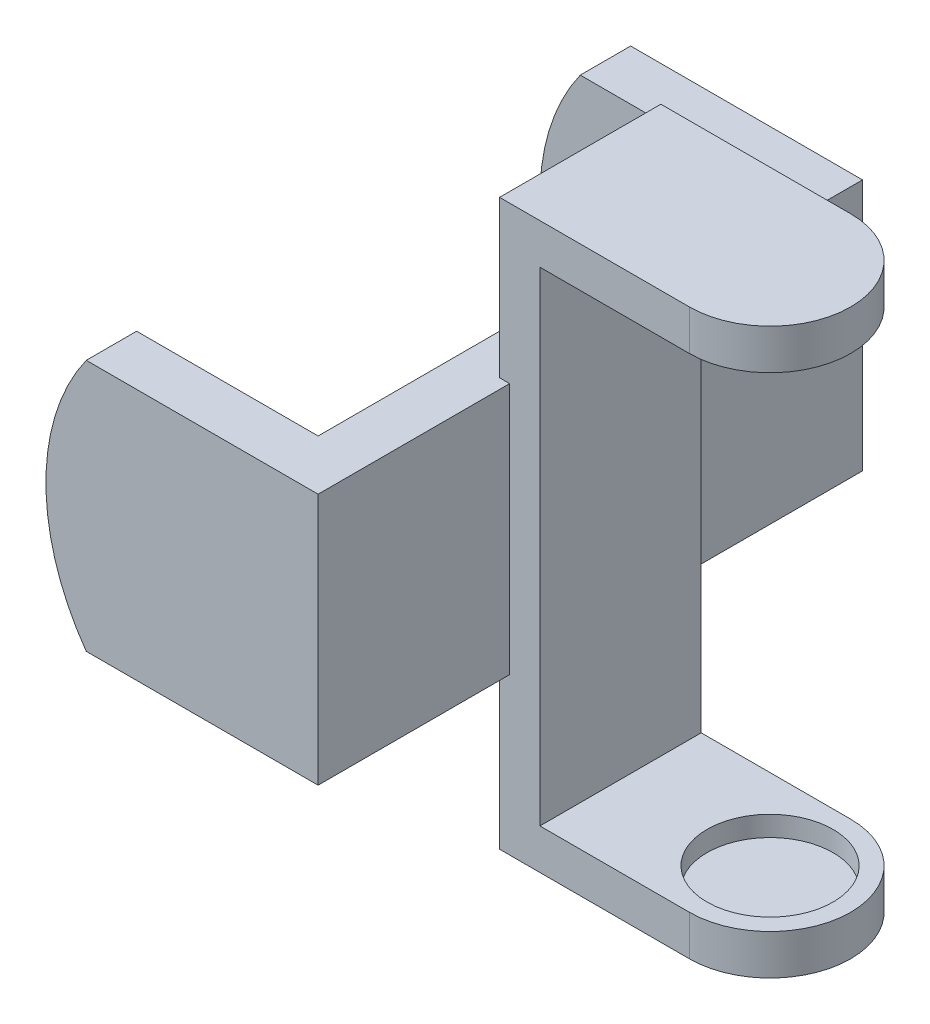
ISO-10303-21;
HEADER;
FILE_DESCRIPTION(('STEP AP214'),'2;1');
FILE_NAME('part.step','',(''),(''),'','','');
FILE_SCHEMA(('AUTOMOTIVE_DESIGN { 1 0 10303 214 1 1 1 1 }'));
ENDSEC;
DATA;
#1=APPLICATION_CONTEXT('core data for automotive mechanical design processes');
#2=APPLICATION_PROTOCOL_DEFINITION('international standard','automotive_design',2000,#1);
#3=PRODUCT_CONTEXT('',#1,'mechanical');
#4=PRODUCT('Part','Part','',(#3));
#5=PRODUCT_RELATED_PRODUCT_CATEGORY('part','',(#4));
#6=PRODUCT_DEFINITION_FORMATION('','',#4);
#7=PRODUCT_DEFINITION_CONTEXT('part definition',#1,'design');
#8=PRODUCT_DEFINITION('design','',#6,#7);
#9=PRODUCT_DEFINITION_SHAPE('','',#8);
#10=(LENGTH_UNIT() NAMED_UNIT(*) SI_UNIT(.MILLI.,.METRE.));
#11=(NAMED_UNIT(*) PLANE_ANGLE_UNIT() SI_UNIT($,.RADIAN.));
#12=(NAMED_UNIT(*) SI_UNIT($,.STERADIAN.) SOLID_ANGLE_UNIT());
#13=UNCERTAINTY_MEASURE_WITH_UNIT(LENGTH_MEASURE(1.E-05),#10,'distance_accuracy_value','');
#14=(GEOMETRIC_REPRESENTATION_CONTEXT(3) GLOBAL_UNCERTAINTY_ASSIGNED_CONTEXT((#13)) GLOBAL_UNIT_ASSIGNED_CONTEXT((#10,
#11,#12)) REPRESENTATION_CONTEXT('',''));
#15=CARTESIAN_POINT('',(0.,0.,0.));
#16=DIRECTION('',(0.,0.,1.));
#17=DIRECTION('',(1.,0.,0.));
#18=AXIS2_PLACEMENT_3D('',#15,#16,#17);
#19=CARTESIAN_POINT('',(0.,56.,-16.));
#20=DIRECTION('',(0.,0.,-1.));
#21=DIRECTION('',(-1.,0.,0.));
#22=AXIS2_PLACEMENT_3D('',#19,#20,#21);
#23=PLANE('',#22);
#24=DIRECTION('',(0.,1.,0.));
#25=VECTOR('',#24,1.);
#26=CARTESIAN_POINT('',(1.,56.,-16.));
#27=LINE('',#26,#25);
#28=CARTESIAN_POINT('',(1.,15.5,-16.));
#29=VERTEX_POINT('',#28);
#30=CARTESIAN_POINT('',(1.,40.5,-16.));
#31=VERTEX_POINT('',#30);
#32=EDGE_CURVE('E263',#29,#31,#27,.T.);
#33=ORIENTED_EDGE('',*,*,#32,.T.);
#34=DIRECTION('',(-1.,0.,0.));
#35=VECTOR('',#34,1.);
#36=CARTESIAN_POINT('',(0.,40.5,-16.));
#37=LINE('',#36,#35);
#38=CARTESIAN_POINT('',(0.,40.5,-16.));
#39=VERTEX_POINT('',#38);
#40=EDGE_CURVE('E260',#31,#39,#37,.T.);
#41=ORIENTED_EDGE('',*,*,#40,.T.);
#42=DIRECTION('',(0.,-1.,0.));
#43=VECTOR('',#42,1.);
#44=CARTESIAN_POINT('',(0.,56.,-16.));
#45=LINE('',#44,#43);
#46=CARTESIAN_POINT('',(0.,56.,-16.));
#47=VERTEX_POINT('',#46);
#48=EDGE_CURVE('E337',#47,#39,#45,.T.);
#49=ORIENTED_EDGE('',*,*,#48,.F.);
#50=DIRECTION('',(1.,0.,0.));
#51=VECTOR('',#50,1.);
#52=CARTESIAN_POINT('',(0.,56.,-16.));
#53=LINE('',#52,#51);
#54=CARTESIAN_POINT('',(18.828724192887,56.,-16.));
#55=VERTEX_POINT('',#54);
#56=EDGE_CURVE('E308',#47,#55,#53,.T.);
#57=ORIENTED_EDGE('',*,*,#56,.T.);
#58=DIRECTION('',(0.,-1.,0.));
#59=VECTOR('',#58,1.);
#60=CARTESIAN_POINT('',(18.828724192887,56.,-16.));
#61=LINE('',#60,#59);
#62=CARTESIAN_POINT('',(18.828724192887,52.,-16.));
#63=VERTEX_POINT('',#62);
#64=EDGE_CURVE('E341',#55,#63,#61,.T.);
#65=ORIENTED_EDGE('',*,*,#64,.T.);
#66=DIRECTION('',(1.,0.,0.));
#67=VECTOR('',#66,1.);
#68=CARTESIAN_POINT('',(0.,52.,-16.));
#69=LINE('',#68,#67);
#70=CARTESIAN_POINT('',(4.,52.,-16.));
#71=VERTEX_POINT('',#70);
#72=EDGE_CURVE('E288',#71,#63,#69,.T.);
#73=ORIENTED_EDGE('',*,*,#72,.F.);
#74=DIRECTION('',(0.,-1.,0.));
#75=VECTOR('',#74,1.);
#76=CARTESIAN_POINT('',(4.,56.,-16.));
#77=LINE('',#76,#75);
#78=CARTESIAN_POINT('',(4.,4.,-16.));
#79=VERTEX_POINT('',#78);
#80=EDGE_CURVE('E291',#71,#79,#77,.T.);
#81=ORIENTED_EDGE('',*,*,#80,.T.);
#82=DIRECTION('',(1.,0.,0.));
#83=VECTOR('',#82,1.);
#84=CARTESIAN_POINT('',(0.,4.,-16.));
#85=LINE('',#84,#83);
#86=CARTESIAN_POINT('',(18.828724192887,4.,-16.));
#87=VERTEX_POINT('',#86);
#88=EDGE_CURVE('E283',#79,#87,#85,.T.);
#89=ORIENTED_EDGE('',*,*,#88,.T.);
#90=CARTESIAN_POINT('',(18.828724192887,0.,-16.));
#91=VERTEX_POINT('',#90);
#92=EDGE_CURVE('E340',#87,#91,#61,.T.);
#93=ORIENTED_EDGE('',*,*,#92,.T.);
#94=DIRECTION('',(1.,0.,0.));
#95=VECTOR('',#94,1.);
#96=CARTESIAN_POINT('',(0.,0.,-16.));
#97=LINE('',#96,#95);
#98=CARTESIAN_POINT('',(0.,0.,-16.));
#99=VERTEX_POINT('',#98);
#100=EDGE_CURVE('E321',#99,#91,#97,.T.);
#101=ORIENTED_EDGE('',*,*,#100,.F.);
#102=CARTESIAN_POINT('',(0.,15.5,-16.));
#103=VERTEX_POINT('',#102);
#104=EDGE_CURVE('E336',#103,#99,#45,.T.);
#105=ORIENTED_EDGE('',*,*,#104,.F.);
#106=DIRECTION('',(1.,0.,0.));
#107=VECTOR('',#106,1.);
#108=CARTESIAN_POINT('',(0.,15.5,-16.));
#109=LINE('',#108,#107);
#110=EDGE_CURVE('E254',#103,#29,#109,.T.);
#111=ORIENTED_EDGE('',*,*,#110,.T.);
#112=EDGE_LOOP('',(#33,#41,#49,#57,#65,#73,#81,#89,#93,#101,#105,#111));
#113=FACE_BOUND('',#112,.T.);
#114=ADVANCED_FACE('F41',(#113),#23,.T.);
#115=CARTESIAN_POINT('',(0.,56.,0.));
#116=DIRECTION('',(0.,0.,1.));
#117=DIRECTION('',(1.,0.,0.));
#118=AXIS2_PLACEMENT_3D('',#115,#116,#117);
#119=PLANE('',#118);
#120=DIRECTION('',(0.,-1.,0.));
#121=VECTOR('',#120,1.);
#122=CARTESIAN_POINT('',(0.,56.,0.));
#123=LINE('',#122,#121);
#124=CARTESIAN_POINT('',(0.,56.,0.));
#125=VERTEX_POINT('',#124);
#126=CARTESIAN_POINT('',(0.,40.5,0.));
#127=VERTEX_POINT('',#126);
#128=EDGE_CURVE('E333',#125,#127,#123,.T.);
#129=ORIENTED_EDGE('',*,*,#128,.T.);
#130=DIRECTION('',(1.,0.,0.));
#131=VECTOR('',#130,1.);
#132=CARTESIAN_POINT('',(0.,40.5,0.));
#133=LINE('',#132,#131);
#134=CARTESIAN_POINT('',(1.,40.5,0.));
#135=VERTEX_POINT('',#134);
#136=EDGE_CURVE('E257',#127,#135,#133,.T.);
#137=ORIENTED_EDGE('',*,*,#136,.T.);
#138=DIRECTION('',(0.,-1.,0.));
#139=VECTOR('',#138,1.);
#140=CARTESIAN_POINT('',(1.,56.,0.));
#141=LINE('',#140,#139);
#142=CARTESIAN_POINT('',(1.,15.5,0.));
#143=VERTEX_POINT('',#142);
#144=EDGE_CURVE('E11',#135,#143,#141,.T.);
#145=ORIENTED_EDGE('',*,*,#144,.T.);
#146=DIRECTION('',(-1.,0.,0.));
#147=VECTOR('',#146,1.);
#148=CARTESIAN_POINT('',(0.,15.5,0.));
#149=LINE('',#148,#147);
#150=CARTESIAN_POINT('',(0.,15.5,0.));
#151=VERTEX_POINT('',#150);
#152=EDGE_CURVE('E251',#143,#151,#149,.T.);
#153=ORIENTED_EDGE('',*,*,#152,.T.);
#154=CARTESIAN_POINT('',(0.,0.,0.));
#155=VERTEX_POINT('',#154);
#156=EDGE_CURVE('E332',#151,#155,#123,.T.);
#157=ORIENTED_EDGE('',*,*,#156,.T.);
#158=DIRECTION('',(-1.,0.,0.));
#159=VECTOR('',#158,1.);
#160=CARTESIAN_POINT('',(0.,0.,0.));
#161=LINE('',#160,#159);
#162=CARTESIAN_POINT('',(18.828724192887,0.,0.));
#163=VERTEX_POINT('',#162);
#164=EDGE_CURVE('E309',#163,#155,#161,.T.);
#165=ORIENTED_EDGE('',*,*,#164,.F.);
#166=DIRECTION('',(0.,-1.,0.));
#167=VECTOR('',#166,1.);
#168=CARTESIAN_POINT('',(18.828724192887,56.,0.));
#169=LINE('',#168,#167);
#170=CARTESIAN_POINT('',(18.828724192887,4.,0.));
#171=VERTEX_POINT('',#170);
#172=EDGE_CURVE('E318',#171,#163,#169,.T.);
#173=ORIENTED_EDGE('',*,*,#172,.F.);
#174=DIRECTION('',(-1.,0.,0.));
#175=VECTOR('',#174,1.);
#176=CARTESIAN_POINT('',(0.,4.,0.));
#177=LINE('',#176,#175);
#178=CARTESIAN_POINT('',(4.,4.,0.));
#179=VERTEX_POINT('',#178);
#180=EDGE_CURVE('E282',#171,#179,#177,.T.);
#181=ORIENTED_EDGE('',*,*,#180,.T.);
#182=DIRECTION('',(0.,-1.,0.));
#183=VECTOR('',#182,1.);
#184=CARTESIAN_POINT('',(4.,56.,0.));
#185=LINE('',#184,#183);
#186=CARTESIAN_POINT('',(4.,52.,0.));
#187=VERTEX_POINT('',#186);
#188=EDGE_CURVE('E289',#187,#179,#185,.T.);
#189=ORIENTED_EDGE('',*,*,#188,.F.);
#190=DIRECTION('',(-1.,0.,0.));
#191=VECTOR('',#190,1.);
#192=CARTESIAN_POINT('',(0.,52.,0.));
#193=LINE('',#192,#191);
#194=CARTESIAN_POINT('',(18.828724192887,52.,0.));
#195=VERTEX_POINT('',#194);
#196=EDGE_CURVE('E287',#195,#187,#193,.T.);
#197=ORIENTED_EDGE('',*,*,#196,.F.);
#198=CARTESIAN_POINT('',(18.828724192887,56.,0.));
#199=VERTEX_POINT('',#198);
#200=EDGE_CURVE('E329',#199,#195,#169,.T.);
#201=ORIENTED_EDGE('',*,*,#200,.F.);
#202=DIRECTION('',(-1.,0.,0.));
#203=VECTOR('',#202,1.);
#204=CARTESIAN_POINT('',(0.,56.,0.));
#205=LINE('',#204,#203);
#206=EDGE_CURVE('E315',#199,#125,#205,.T.);
#207=ORIENTED_EDGE('',*,*,#206,.T.);
#208=EDGE_LOOP('',(#129,#137,#145,#153,#157,#165,#173,#181,#189,#197,#201,#207));
#209=FACE_BOUND('',#208,.T.);
#210=ADVANCED_FACE('F352',(#209),#119,.T.);
#211=CARTESIAN_POINT('',(0.,56.,0.));
#212=DIRECTION('',(-1.,0.,0.));
#213=DIRECTION('',(0.,0.,1.));
#214=AXIS2_PLACEMENT_3D('',#211,#212,#213);
#215=PLANE('',#214);
#216=ORIENTED_EDGE('',*,*,#48,.T.);
#217=DIRECTION('',(0.,0.,1.));
#218=VECTOR('',#217,1.);
#219=CARTESIAN_POINT('',(0.,40.5,0.));
#220=LINE('',#219,#218);
#221=EDGE_CURVE('E49',#39,#127,#220,.T.);
#222=ORIENTED_EDGE('',*,*,#221,.T.);
#223=ORIENTED_EDGE('',*,*,#128,.F.);
#224=DIRECTION('',(0.,0.,-1.));
#225=VECTOR('',#224,1.);
#226=CARTESIAN_POINT('',(0.,56.,0.));
#227=LINE('',#226,#225);
#228=EDGE_CURVE('E312',#125,#47,#227,.T.);
#229=ORIENTED_EDGE('',*,*,#228,.T.);
#230=EDGE_LOOP('',(#216,#222,#223,#229));
#231=FACE_BOUND('',#230,.T.);
#232=ADVANCED_FACE('F348',(#231),#215,.T.);
#233=ORIENTED_EDGE('',*,*,#156,.F.);
#234=DIRECTION('',(0.,0.,-1.));
#235=VECTOR('',#234,1.);
#236=CARTESIAN_POINT('',(0.,15.5,0.));
#237=LINE('',#236,#235);
#238=EDGE_CURVE('E344',#151,#103,#237,.T.);
#239=ORIENTED_EDGE('',*,*,#238,.T.);
#240=ORIENTED_EDGE('',*,*,#104,.T.);
#241=DIRECTION('',(0.,0.,-1.));
#242=VECTOR('',#241,1.);
#243=CARTESIAN_POINT('',(0.,0.,0.));
#244=LINE('',#243,#242);
#245=EDGE_CURVE('E324',#155,#99,#244,.T.);
#246=ORIENTED_EDGE('',*,*,#245,.F.);
#247=EDGE_LOOP('',(#233,#239,#240,#246));
#248=FACE_BOUND('',#247,.T.);
#249=ADVANCED_FACE('F388',(#248),#215,.T.);
#250=CARTESIAN_POINT('',(18.828724192887,56.,-8.));
#251=DIRECTION('',(0.,-1.,0.));
#252=DIRECTION('',(0.,0.,-1.));
#253=AXIS2_PLACEMENT_3D('',#250,#251,#252);
#254=CYLINDRICAL_SURFACE('',#253,8.);
#255=ORIENTED_EDGE('',*,*,#92,.F.);
#256=CARTESIAN_POINT('',(18.828724192887,4.,-8.));
#257=DIRECTION('',(0.,1.,0.));
#258=DIRECTION('',(0.,0.,1.));
#259=AXIS2_PLACEMENT_3D('',#256,#257,#258);
#260=CIRCLE('',#259,8.);
#261=EDGE_CURVE('E276',#87,#171,#260,.F.);
#262=ORIENTED_EDGE('',*,*,#261,.T.);
#263=ORIENTED_EDGE('',*,*,#172,.T.);
#264=CARTESIAN_POINT('',(18.828724192887,0.,-8.));
#265=DIRECTION('',(0.,1.,0.));
#266=DIRECTION('',(0.,0.,1.));
#267=AXIS2_PLACEMENT_3D('',#264,#265,#266);
#268=CIRCLE('',#267,8.);
#269=EDGE_CURVE('E301',#91,#163,#268,.F.);
#270=ORIENTED_EDGE('',*,*,#269,.F.);
#271=EDGE_LOOP('',(#255,#262,#263,#270));
#272=FACE_BOUND('',#271,.T.);
#273=ADVANCED_FACE('F398',(#272),#254,.T.);
#274=CARTESIAN_POINT('',(18.828724192887,52.,-8.));
#275=DIRECTION('',(0.,1.,0.));
#276=DIRECTION('',(0.,0.,1.));
#277=AXIS2_PLACEMENT_3D('',#274,#275,#276);
#278=CIRCLE('',#277,8.);
#279=EDGE_CURVE('E294',#63,#195,#278,.F.);
#280=ORIENTED_EDGE('',*,*,#279,.F.);
#281=ORIENTED_EDGE('',*,*,#64,.F.);
#282=CARTESIAN_POINT('',(18.828724192887,56.,-8.));
#283=DIRECTION('',(0.,1.,0.));
#284=DIRECTION('',(0.,0.,1.));
#285=AXIS2_PLACEMENT_3D('',#282,#283,#284);
#286=CIRCLE('',#285,8.);
#287=EDGE_CURVE('E305',#55,#199,#286,.F.);
#288=ORIENTED_EDGE('',*,*,#287,.T.);
#289=ORIENTED_EDGE('',*,*,#200,.T.);
#290=EDGE_LOOP('',(#280,#281,#288,#289));
#291=FACE_BOUND('',#290,.T.);
#292=ADVANCED_FACE('F43',(#291),#254,.T.);
#293=CARTESIAN_POINT('',(0.,56.,0.));
#294=DIRECTION('',(0.,1.,0.));
#295=DIRECTION('',(0.,0.,1.));
#296=AXIS2_PLACEMENT_3D('',#293,#294,#295);
#297=PLANE('',#296);
#298=ORIENTED_EDGE('',*,*,#287,.F.);
#299=ORIENTED_EDGE('',*,*,#56,.F.);
#300=ORIENTED_EDGE('',*,*,#228,.F.);
#301=ORIENTED_EDGE('',*,*,#206,.F.);
#302=EDGE_LOOP('',(#298,#299,#300,#301));
#303=FACE_BOUND('',#302,.T.);
#304=ADVANCED_FACE('F357',(#303),#297,.T.);
#305=CARTESIAN_POINT('',(0.,0.,0.));
#306=DIRECTION('',(0.,1.,0.));
#307=DIRECTION('',(0.,0.,1.));
#308=AXIS2_PLACEMENT_3D('',#305,#306,#307);
#309=PLANE('',#308);
#310=ORIENTED_EDGE('',*,*,#269,.T.);
#311=ORIENTED_EDGE('',*,*,#164,.T.);
#312=ORIENTED_EDGE('',*,*,#245,.T.);
#313=ORIENTED_EDGE('',*,*,#100,.T.);
#314=EDGE_LOOP('',(#310,#311,#312,#313));
#315=FACE_BOUND('',#314,.T.);
#316=ADVANCED_FACE('F392',(#315),#309,.F.);
#317=CARTESIAN_POINT('',(4.,56.,0.));
#318=DIRECTION('',(-1.,0.,0.));
#319=DIRECTION('',(0.,0.,1.));
#320=AXIS2_PLACEMENT_3D('',#317,#318,#319);
#321=PLANE('',#320);
#322=DIRECTION('',(0.,0.,-1.));
#323=VECTOR('',#322,1.);
#324=CARTESIAN_POINT('',(4.,4.,0.));
#325=LINE('',#324,#323);
#326=EDGE_CURVE('E279',#179,#79,#325,.T.);
#327=ORIENTED_EDGE('',*,*,#326,.T.);
#328=ORIENTED_EDGE('',*,*,#80,.F.);
#329=DIRECTION('',(0.,0.,-1.));
#330=VECTOR('',#329,1.);
#331=CARTESIAN_POINT('',(4.,52.,0.));
#332=LINE('',#331,#330);
#333=EDGE_CURVE('E284',#187,#71,#332,.T.);
#334=ORIENTED_EDGE('',*,*,#333,.F.);
#335=ORIENTED_EDGE('',*,*,#188,.T.);
#336=EDGE_LOOP('',(#327,#328,#334,#335));
#337=FACE_BOUND('',#336,.T.);
#338=ADVANCED_FACE('F404',(#337),#321,.F.);
#339=CARTESIAN_POINT('',(0.,52.,0.));
#340=DIRECTION('',(0.,1.,0.));
#341=DIRECTION('',(0.,0.,1.));
#342=AXIS2_PLACEMENT_3D('',#339,#340,#341);
#343=PLANE('',#342);
#344=CARTESIAN_POINT('',(18.828724192887,52.,-8.));
#345=DIRECTION('',(0.,1.,0.));
#346=DIRECTION('',(0.,0.,1.));
#347=AXIS2_PLACEMENT_3D('',#344,#345,#346);
#348=CIRCLE('',#347,6.25);
#349=CARTESIAN_POINT('',(18.828724192887,52.,-1.75));
#350=VERTEX_POINT('',#349);
#351=EDGE_CURVE('E266',#350,#350,#348,.T.);
#352=ORIENTED_EDGE('',*,*,#351,.T.);
#353=EDGE_LOOP('',(#352));
#354=FACE_BOUND('',#353,.T.);
#355=ORIENTED_EDGE('',*,*,#279,.T.);
#356=ORIENTED_EDGE('',*,*,#196,.T.);
#357=ORIENTED_EDGE('',*,*,#333,.T.);
#358=ORIENTED_EDGE('',*,*,#72,.T.);
#359=EDGE_LOOP('',(#355,#356,#357,#358));
#360=FACE_BOUND('',#359,.T.);
#361=ADVANCED_FACE('F406',(#354,#360),#343,.F.);
#362=CARTESIAN_POINT('',(0.,4.,0.));
#363=DIRECTION('',(0.,1.,0.));
#364=DIRECTION('',(0.,0.,1.));
#365=AXIS2_PLACEMENT_3D('',#362,#363,#364);
#366=PLANE('',#365);
#367=CARTESIAN_POINT('',(18.828724192887,4.,-8.));
#368=DIRECTION('',(0.,1.,0.));
#369=DIRECTION('',(0.,0.,1.));
#370=AXIS2_PLACEMENT_3D('',#367,#368,#369);
#371=CIRCLE('',#370,6.25);
#372=CARTESIAN_POINT('',(18.828724192887,4.,-1.75));
#373=VERTEX_POINT('',#372);
#374=EDGE_CURVE('E270',#373,#373,#371,.T.);
#375=ORIENTED_EDGE('',*,*,#374,.F.);
#376=EDGE_LOOP('',(#375));
#377=FACE_BOUND('',#376,.T.);
#378=ORIENTED_EDGE('',*,*,#261,.F.);
#379=ORIENTED_EDGE('',*,*,#88,.F.);
#380=ORIENTED_EDGE('',*,*,#326,.F.);
#381=ORIENTED_EDGE('',*,*,#180,.F.);
#382=EDGE_LOOP('',(#378,#379,#380,#381));
#383=FACE_BOUND('',#382,.T.);
#384=ADVANCED_FACE('F400',(#377,#383),#366,.T.);
#385=CARTESIAN_POINT('',(18.828724192887,2.,-8.));
#386=DIRECTION('',(0.,1.,0.));
#387=DIRECTION('',(0.,0.,1.));
#388=AXIS2_PLACEMENT_3D('',#385,#386,#387);
#389=CYLINDRICAL_SURFACE('',#388,6.25);
#390=CARTESIAN_POINT('',(18.828724192887,2.,-8.));
#391=DIRECTION('',(0.,1.,0.));
#392=DIRECTION('',(0.,0.,1.));
#393=AXIS2_PLACEMENT_3D('',#390,#391,#392);
#394=CIRCLE('',#393,6.25);
#395=CARTESIAN_POINT('',(18.828724192887,2.,-1.75));
#396=VERTEX_POINT('',#395);
#397=EDGE_CURVE('E273',#396,#396,#394,.T.);
#398=ORIENTED_EDGE('',*,*,#397,.F.);
#399=EDGE_LOOP('',(#398));
#400=FACE_BOUND('',#399,.T.);
#401=ORIENTED_EDGE('',*,*,#374,.T.);
#402=EDGE_LOOP('',(#401));
#403=FACE_BOUND('',#402,.T.);
#404=ADVANCED_FACE('F429',(#400,#403),#389,.F.);
#405=CARTESIAN_POINT('',(18.828724192887,2.,-8.));
#406=DIRECTION('',(0.,1.,0.));
#407=DIRECTION('',(0.,0.,1.));
#408=AXIS2_PLACEMENT_3D('',#405,#406,#407);
#409=PLANE('',#408);
#410=ORIENTED_EDGE('',*,*,#397,.T.);
#411=EDGE_LOOP('',(#410));
#412=FACE_BOUND('',#411,.T.);
#413=ADVANCED_FACE('F437',(#412),#409,.T.);
#414=CARTESIAN_POINT('',(18.828724192887,54.,-8.));
#415=DIRECTION('',(0.,-1.,0.));
#416=DIRECTION('',(0.,0.,-1.));
#417=AXIS2_PLACEMENT_3D('',#414,#415,#416);
#418=CYLINDRICAL_SURFACE('',#417,6.25);
#419=CARTESIAN_POINT('',(18.828724192887,54.,-8.));
#420=DIRECTION('',(0.,1.,0.));
#421=DIRECTION('',(0.,0.,1.));
#422=AXIS2_PLACEMENT_3D('',#419,#420,#421);
#423=CIRCLE('',#422,6.25);
#424=CARTESIAN_POINT('',(18.828724192887,54.,-1.75));
#425=VERTEX_POINT('',#424);
#426=EDGE_CURVE('E267',#425,#425,#423,.T.);
#427=ORIENTED_EDGE('',*,*,#426,.T.);
#428=EDGE_LOOP('',(#427));
#429=FACE_BOUND('',#428,.T.);
#430=ORIENTED_EDGE('',*,*,#351,.F.);
#431=EDGE_LOOP('',(#430));
#432=FACE_BOUND('',#431,.T.);
#433=ADVANCED_FACE('F441',(#429,#432),#418,.F.);
#434=CARTESIAN_POINT('',(18.828724192887,54.,-8.));
#435=DIRECTION('',(0.,1.,0.));
#436=DIRECTION('',(0.,0.,1.));
#437=AXIS2_PLACEMENT_3D('',#434,#435,#436);
#438=PLANE('',#437);
#439=ORIENTED_EDGE('',*,*,#426,.F.);
#440=EDGE_LOOP('',(#439));
#441=FACE_BOUND('',#440,.T.);
#442=ADVANCED_FACE('F445',(#441),#438,.F.);
#443=CARTESIAN_POINT('',(1.,0.,0.));
#444=DIRECTION('',(-1.,0.,0.));
#445=DIRECTION('',(0.,0.,1.));
#446=AXIS2_PLACEMENT_3D('',#443,#444,#445);
#447=PLANE('',#446);
#448=ORIENTED_EDGE('',*,*,#32,.F.);
#449=DIRECTION('',(0.,0.,1.));
#450=VECTOR('',#449,1.);
#451=CARTESIAN_POINT('',(1.,15.5,-35.));
#452=LINE('',#451,#450);
#453=CARTESIAN_POINT('',(1.,15.5,-35.));
#454=VERTEX_POINT('',#453);
#455=EDGE_CURVE('E236',#454,#29,#452,.T.);
#456=ORIENTED_EDGE('',*,*,#455,.F.);
#457=DIRECTION('',(0.,-1.,0.));
#458=VECTOR('',#457,1.);
#459=CARTESIAN_POINT('',(1.,40.5,-35.));
#460=LINE('',#459,#458);
#461=CARTESIAN_POINT('',(1.,40.5,-35.));
#462=VERTEX_POINT('',#461);
#463=EDGE_CURVE('E232',#462,#454,#460,.T.);
#464=ORIENTED_EDGE('',*,*,#463,.F.);
#465=DIRECTION('',(0.,0.,-1.));
#466=VECTOR('',#465,1.);
#467=CARTESIAN_POINT('',(1.,40.5,-35.));
#468=LINE('',#467,#466);
#469=EDGE_CURVE('E228',#31,#462,#468,.T.);
#470=ORIENTED_EDGE('',*,*,#469,.F.);
#471=EDGE_LOOP('',(#448,#456,#464,#470));
#472=FACE_BOUND('',#471,.T.);
#473=ADVANCED_FACE('F365',(#472),#447,.F.);
#474=CARTESIAN_POINT('',(-4.,40.5,19.));
#475=DIRECTION('',(0.,0.,-1.));
#476=DIRECTION('',(0.,1.,0.));
#477=AXIS2_PLACEMENT_3D('',#474,#475,#476);
#478=PLANE('',#477);
#479=DIRECTION('',(1.,0.,0.));
#480=VECTOR('',#479,1.);
#481=CARTESIAN_POINT('',(-4.,15.5,19.));
#482=LINE('',#481,#480);
#483=CARTESIAN_POINT('',(-22.,15.5,19.));
#484=VERTEX_POINT('',#483);
#485=CARTESIAN_POINT('',(1.,15.5,19.));
#486=VERTEX_POINT('',#485);
#487=EDGE_CURVE('E241',#484,#486,#482,.T.);
#488=ORIENTED_EDGE('',*,*,#487,.T.);
#489=DIRECTION('',(0.,1.,0.));
#490=VECTOR('',#489,1.);
#491=CARTESIAN_POINT('',(1.,40.5,19.));
#492=LINE('',#491,#490);
#493=CARTESIAN_POINT('',(1.,40.5,19.));
#494=VERTEX_POINT('',#493);
#495=EDGE_CURVE('E223',#486,#494,#492,.T.);
#496=ORIENTED_EDGE('',*,*,#495,.T.);
#497=DIRECTION('',(1.,0.,0.));
#498=VECTOR('',#497,1.);
#499=CARTESIAN_POINT('',(-4.,40.5,19.));
#500=LINE('',#499,#498);
#501=CARTESIAN_POINT('',(-22.,40.5,19.));
#502=VERTEX_POINT('',#501);
#503=EDGE_CURVE('E249',#502,#494,#500,.T.);
#504=ORIENTED_EDGE('',*,*,#503,.F.);
#505=CARTESIAN_POINT('',(-4.46875,28.,19.));
#506=DIRECTION('',(0.,0.,1.));
#507=DIRECTION('',(1.,0.,0.));
#508=AXIS2_PLACEMENT_3D('',#505,#506,#507);
#509=CIRCLE('',#508,21.53125);
#510=EDGE_CURVE('E204',#502,#484,#509,.T.);
#511=ORIENTED_EDGE('',*,*,#510,.T.);
#512=EDGE_LOOP('',(#488,#496,#504,#511));
#513=FACE_BOUND('',#512,.T.);
#514=ADVANCED_FACE('F383',(#513),#478,.F.);
#515=CARTESIAN_POINT('',(-4.,40.5,-35.));
#516=DIRECTION('',(0.,-1.,0.));
#517=DIRECTION('',(0.,0.,-1.));
#518=AXIS2_PLACEMENT_3D('',#515,#516,#517);
#519=PLANE('',#518);
#520=ORIENTED_EDGE('',*,*,#40,.F.);
#521=ORIENTED_EDGE('',*,*,#469,.T.);
#522=DIRECTION('',(1.,0.,0.));
#523=VECTOR('',#522,1.);
#524=CARTESIAN_POINT('',(-4.,40.5,-35.));
#525=LINE('',#524,#523);
#526=CARTESIAN_POINT('',(-22.,40.5,-35.));
#527=VERTEX_POINT('',#526);
#528=EDGE_CURVE('E246',#527,#462,#525,.T.);
#529=ORIENTED_EDGE('',*,*,#528,.F.);
#530=DIRECTION('',(0.,0.,-1.));
#531=VECTOR('',#530,1.);
#532=CARTESIAN_POINT('',(-22.,40.5,-30.));
#533=LINE('',#532,#531);
#534=CARTESIAN_POINT('',(-22.,40.5,-30.));
#535=VERTEX_POINT('',#534);
#536=EDGE_CURVE('E194',#535,#527,#533,.T.);
#537=ORIENTED_EDGE('',*,*,#536,.F.);
#538=DIRECTION('',(-1.,0.,0.));
#539=VECTOR('',#538,1.);
#540=CARTESIAN_POINT('',(-4.,40.5,-30.));
#541=LINE('',#540,#539);
#542=CARTESIAN_POINT('',(-4.,40.5,-30.));
#543=VERTEX_POINT('',#542);
#544=EDGE_CURVE('E182',#543,#535,#541,.T.);
#545=ORIENTED_EDGE('',*,*,#544,.F.);
#546=DIRECTION('',(0.,0.,-1.));
#547=VECTOR('',#546,1.);
#548=CARTESIAN_POINT('',(-4.,40.5,-35.));
#549=LINE('',#548,#547);
#550=CARTESIAN_POINT('',(-4.,40.5,14.));
#551=VERTEX_POINT('',#550);
#552=EDGE_CURVE('E61',#551,#543,#549,.T.);
#553=ORIENTED_EDGE('',*,*,#552,.F.);
#554=DIRECTION('',(-1.,0.,0.));
#555=VECTOR('',#554,1.);
#556=CARTESIAN_POINT('',(0.,40.5,14.));
#557=LINE('',#556,#555);
#558=CARTESIAN_POINT('',(-22.,40.5,14.));
#559=VERTEX_POINT('',#558);
#560=EDGE_CURVE('E206',#551,#559,#557,.T.);
#561=ORIENTED_EDGE('',*,*,#560,.T.);
#562=DIRECTION('',(0.,0.,1.));
#563=VECTOR('',#562,1.);
#564=CARTESIAN_POINT('',(-22.,40.5,14.));
#565=LINE('',#564,#563);
#566=EDGE_CURVE('E217',#559,#502,#565,.T.);
#567=ORIENTED_EDGE('',*,*,#566,.T.);
#568=ORIENTED_EDGE('',*,*,#503,.T.);
#569=EDGE_CURVE('E229',#494,#135,#468,.T.);
#570=ORIENTED_EDGE('',*,*,#569,.T.);
#571=ORIENTED_EDGE('',*,*,#136,.F.);
#572=ORIENTED_EDGE('',*,*,#221,.F.);
#573=EDGE_LOOP('',(#520,#521,#529,#537,#545,#553,#561,#567,#568,#570,#571,#572));
#574=FACE_BOUND('',#573,.T.);
#575=ADVANCED_FACE('F362',(#574),#519,.F.);
#576=CARTESIAN_POINT('',(-4.,40.5,-35.));
#577=DIRECTION('',(0.,0.,1.));
#578=DIRECTION('',(1.,0.,0.));
#579=AXIS2_PLACEMENT_3D('',#576,#577,#578);
#580=PLANE('',#579);
#581=ORIENTED_EDGE('',*,*,#528,.T.);
#582=ORIENTED_EDGE('',*,*,#463,.T.);
#583=DIRECTION('',(1.,0.,0.));
#584=VECTOR('',#583,1.);
#585=CARTESIAN_POINT('',(-4.,15.5,-35.));
#586=LINE('',#585,#584);
#587=CARTESIAN_POINT('',(-22.,15.5,-35.));
#588=VERTEX_POINT('',#587);
#589=EDGE_CURVE('E244',#588,#454,#586,.T.);
#590=ORIENTED_EDGE('',*,*,#589,.F.);
#591=CARTESIAN_POINT('',(-4.46875,28.,-35.));
#592=DIRECTION('',(0.,0.,1.));
#593=DIRECTION('',(1.,0.,0.));
#594=AXIS2_PLACEMENT_3D('',#591,#592,#593);
#595=CIRCLE('',#594,21.53125);
#596=EDGE_CURVE('E192',#527,#588,#595,.T.);
#597=ORIENTED_EDGE('',*,*,#596,.F.);
#598=EDGE_LOOP('',(#581,#582,#590,#597));
#599=FACE_BOUND('',#598,.T.);
#600=ADVANCED_FACE('F368',(#599),#580,.F.);
#601=CARTESIAN_POINT('',(-4.,15.5,-35.));
#602=DIRECTION('',(0.,1.,0.));
#603=DIRECTION('',(0.,0.,1.));
#604=AXIS2_PLACEMENT_3D('',#601,#602,#603);
#605=PLANE('',#604);
#606=ORIENTED_EDGE('',*,*,#110,.F.);
#607=ORIENTED_EDGE('',*,*,#238,.F.);
#608=ORIENTED_EDGE('',*,*,#152,.F.);
#609=EDGE_CURVE('E235',#143,#486,#452,.T.);
#610=ORIENTED_EDGE('',*,*,#609,.T.);
#611=ORIENTED_EDGE('',*,*,#487,.F.);
#612=DIRECTION('',(0.,0.,1.));
#613=VECTOR('',#612,1.);
#614=CARTESIAN_POINT('',(-22.,15.5,14.));
#615=LINE('',#614,#613);
#616=CARTESIAN_POINT('',(-22.,15.5,14.));
#617=VERTEX_POINT('',#616);
#618=EDGE_CURVE('E220',#617,#484,#615,.T.);
#619=ORIENTED_EDGE('',*,*,#618,.F.);
#620=DIRECTION('',(1.,0.,0.));
#621=VECTOR('',#620,1.);
#622=CARTESIAN_POINT('',(0.,15.5,14.));
#623=LINE('',#622,#621);
#624=CARTESIAN_POINT('',(-4.,15.5,14.));
#625=VERTEX_POINT('',#624);
#626=EDGE_CURVE('E212',#617,#625,#623,.T.);
#627=ORIENTED_EDGE('',*,*,#626,.T.);
#628=DIRECTION('',(0.,0.,1.));
#629=VECTOR('',#628,1.);
#630=CARTESIAN_POINT('',(-4.,15.5,-35.));
#631=LINE('',#630,#629);
#632=CARTESIAN_POINT('',(-4.,15.5,-30.));
#633=VERTEX_POINT('',#632);
#634=EDGE_CURVE('E198',#633,#625,#631,.T.);
#635=ORIENTED_EDGE('',*,*,#634,.F.);
#636=DIRECTION('',(1.,0.,0.));
#637=VECTOR('',#636,1.);
#638=CARTESIAN_POINT('',(-4.,15.5,-30.));
#639=LINE('',#638,#637);
#640=CARTESIAN_POINT('',(-22.,15.5,-30.));
#641=VERTEX_POINT('',#640);
#642=EDGE_CURVE('E181',#641,#633,#639,.T.);
#643=ORIENTED_EDGE('',*,*,#642,.F.);
#644=DIRECTION('',(0.,0.,-1.));
#645=VECTOR('',#644,1.);
#646=CARTESIAN_POINT('',(-22.,15.5,-30.));
#647=LINE('',#646,#645);
#648=EDGE_CURVE('E189',#641,#588,#647,.T.);
#649=ORIENTED_EDGE('',*,*,#648,.T.);
#650=ORIENTED_EDGE('',*,*,#589,.T.);
#651=ORIENTED_EDGE('',*,*,#455,.T.);
#652=EDGE_LOOP('',(#606,#607,#608,#610,#611,#619,#627,#635,#643,#649,#650,#651));
#653=FACE_BOUND('',#652,.T.);
#654=ADVANCED_FACE('F196',(#653),#605,.F.);
#655=CARTESIAN_POINT('',(-4.,0.,0.));
#656=DIRECTION('',(-1.,0.,0.));
#657=DIRECTION('',(0.,0.,1.));
#658=AXIS2_PLACEMENT_3D('',#655,#656,#657);
#659=PLANE('',#658);
#660=DIRECTION('',(0.,-1.,0.));
#661=VECTOR('',#660,1.);
#662=CARTESIAN_POINT('',(-4.,40.5,-30.));
#663=LINE('',#662,#661);
#664=EDGE_CURVE('E56',#543,#633,#663,.T.);
#665=ORIENTED_EDGE('',*,*,#664,.T.);
#666=ORIENTED_EDGE('',*,*,#634,.T.);
#667=DIRECTION('',(0.,-1.,0.));
#668=VECTOR('',#667,1.);
#669=CARTESIAN_POINT('',(-4.,0.,14.));
#670=LINE('',#669,#668);
#671=EDGE_CURVE('E214',#551,#625,#670,.T.);
#672=ORIENTED_EDGE('',*,*,#671,.F.);
#673=ORIENTED_EDGE('',*,*,#552,.T.);
#674=EDGE_LOOP('',(#665,#666,#672,#673));
#675=FACE_BOUND('',#674,.T.);
#676=ADVANCED_FACE('F457',(#675),#659,.T.);
#677=ORIENTED_EDGE('',*,*,#144,.F.);
#678=ORIENTED_EDGE('',*,*,#569,.F.);
#679=ORIENTED_EDGE('',*,*,#495,.F.);
#680=ORIENTED_EDGE('',*,*,#609,.F.);
#681=EDGE_LOOP('',(#677,#678,#679,#680));
#682=FACE_BOUND('',#681,.T.);
#683=ADVANCED_FACE('F381',(#682),#447,.F.);
#684=CARTESIAN_POINT('',(-4.46875,28.,14.));
#685=DIRECTION('',(0.,0.,1.));
#686=DIRECTION('',(1.,0.,0.));
#687=AXIS2_PLACEMENT_3D('',#684,#685,#686);
#688=CYLINDRICAL_SURFACE('',#687,21.53125);
#689=ORIENTED_EDGE('',*,*,#510,.F.);
#690=ORIENTED_EDGE('',*,*,#566,.F.);
#691=CARTESIAN_POINT('',(-4.46875,28.,14.));
#692=DIRECTION('',(0.,0.,1.));
#693=DIRECTION('',(1.,0.,0.));
#694=AXIS2_PLACEMENT_3D('',#691,#692,#693);
#695=CIRCLE('',#694,21.53125);
#696=EDGE_CURVE('E209',#559,#617,#695,.T.);
#697=ORIENTED_EDGE('',*,*,#696,.T.);
#698=ORIENTED_EDGE('',*,*,#618,.T.);
#699=EDGE_LOOP('',(#689,#690,#697,#698));
#700=FACE_BOUND('',#699,.T.);
#701=ADVANCED_FACE('F376',(#700),#688,.T.);
#702=CARTESIAN_POINT('',(0.,0.,14.));
#703=DIRECTION('',(0.,0.,1.));
#704=DIRECTION('',(1.,0.,0.));
#705=AXIS2_PLACEMENT_3D('',#702,#703,#704);
#706=PLANE('',#705);
#707=ORIENTED_EDGE('',*,*,#560,.F.);
#708=ORIENTED_EDGE('',*,*,#671,.T.);
#709=ORIENTED_EDGE('',*,*,#626,.F.);
#710=ORIENTED_EDGE('',*,*,#696,.F.);
#711=EDGE_LOOP('',(#707,#708,#709,#710));
#712=FACE_BOUND('',#711,.T.);
#713=ADVANCED_FACE('F372',(#712),#706,.F.);
#714=CARTESIAN_POINT('',(-4.46875,28.,-30.));
#715=DIRECTION('',(0.,0.,-1.));
#716=DIRECTION('',(-1.,0.,0.));
#717=AXIS2_PLACEMENT_3D('',#714,#715,#716);
#718=CYLINDRICAL_SURFACE('',#717,21.53125);
#719=ORIENTED_EDGE('',*,*,#596,.T.);
#720=ORIENTED_EDGE('',*,*,#648,.F.);
#721=CARTESIAN_POINT('',(-4.46875,28.,-30.));
#722=DIRECTION('',(0.,0.,1.));
#723=DIRECTION('',(1.,0.,0.));
#724=AXIS2_PLACEMENT_3D('',#721,#722,#723);
#725=CIRCLE('',#724,21.53125);
#726=EDGE_CURVE('E177',#535,#641,#725,.T.);
#727=ORIENTED_EDGE('',*,*,#726,.F.);
#728=ORIENTED_EDGE('',*,*,#536,.T.);
#729=EDGE_LOOP('',(#719,#720,#727,#728));
#730=FACE_BOUND('',#729,.T.);
#731=ADVANCED_FACE('F190',(#730),#718,.T.);
#732=CARTESIAN_POINT('',(-4.46875,28.,-30.));
#733=DIRECTION('',(0.,0.,1.));
#734=DIRECTION('',(1.,0.,0.));
#735=AXIS2_PLACEMENT_3D('',#732,#733,#734);
#736=PLANE('',#735);
#737=ORIENTED_EDGE('',*,*,#664,.F.);
#738=ORIENTED_EDGE('',*,*,#544,.T.);
#739=ORIENTED_EDGE('',*,*,#726,.T.);
#740=ORIENTED_EDGE('',*,*,#642,.T.);
#741=EDGE_LOOP('',(#737,#738,#739,#740));
#742=FACE_BOUND('',#741,.T.);
#743=ADVANCED_FACE('F179',(#742),#736,.T.);
#744=CLOSED_SHELL('',(#114,#210,#232,#249,#273,#292,#304,#316,#338,#361,#384,#404,#413,#433,
#442,#473,#514,#575,#600,#654,#676,#683,#701,#713,#731,#743));
#745=MANIFOLD_SOLID_BREP('B2',#744);
#746=ADVANCED_BREP_SHAPE_REPRESENTATION('',(#18,#745),#14);
#747=SHAPE_DEFINITION_REPRESENTATION(#9,#746);
ENDSEC;
END-ISO-10303-21;
